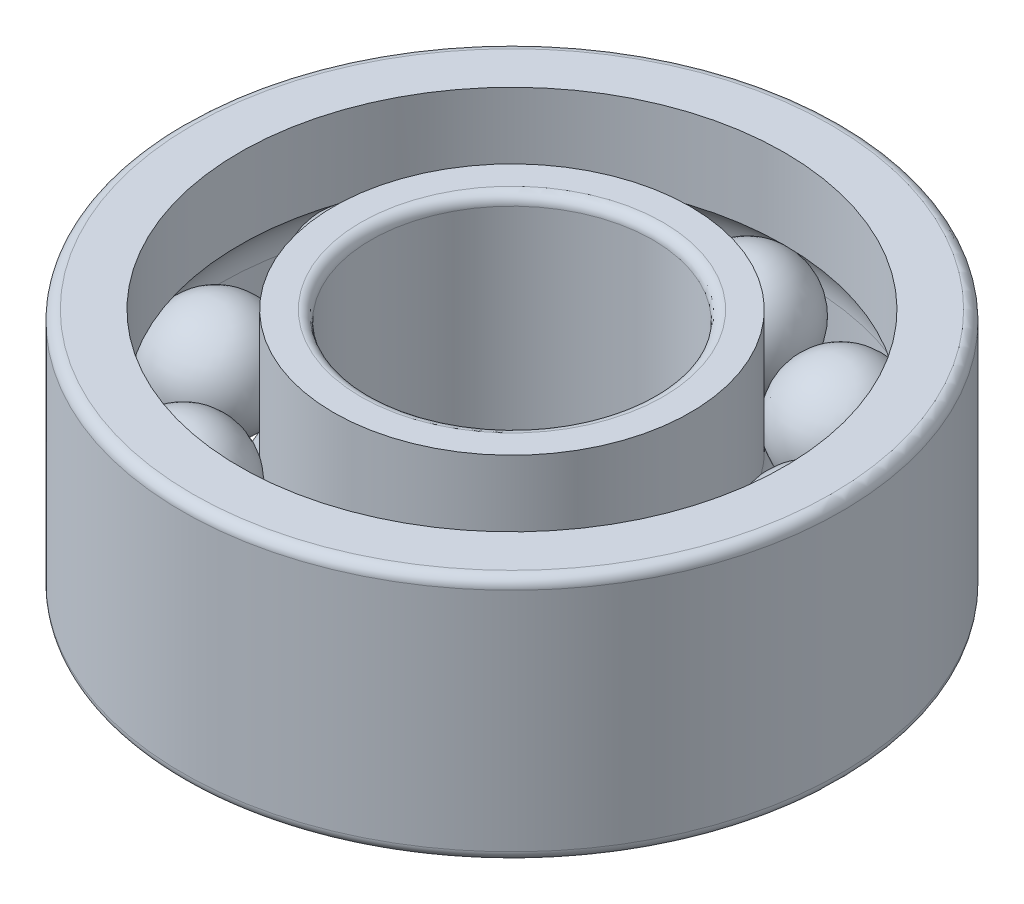
ISO-10303-21;
HEADER;
FILE_DESCRIPTION(('STEP AP214'),'2;1');
FILE_NAME('part.step','',(''),(''),'','','');
FILE_SCHEMA(('AUTOMOTIVE_DESIGN { 1 0 10303 214 1 1 1 1 }'));
ENDSEC;
DATA;
#1=APPLICATION_CONTEXT('core data for automotive mechanical design processes');
#2=APPLICATION_PROTOCOL_DEFINITION('international standard','automotive_design',2000,#1);
#3=PRODUCT_CONTEXT('',#1,'mechanical');
#4=PRODUCT('Part','Part','',(#3));
#5=PRODUCT_RELATED_PRODUCT_CATEGORY('part','',(#4));
#6=PRODUCT_DEFINITION_FORMATION('','',#4);
#7=PRODUCT_DEFINITION_CONTEXT('part definition',#1,'design');
#8=PRODUCT_DEFINITION('design','',#6,#7);
#9=PRODUCT_DEFINITION_SHAPE('','',#8);
#10=(LENGTH_UNIT() NAMED_UNIT(*) SI_UNIT(.MILLI.,.METRE.));
#11=(NAMED_UNIT(*) PLANE_ANGLE_UNIT() SI_UNIT($,.RADIAN.));
#12=(NAMED_UNIT(*) SI_UNIT($,.STERADIAN.) SOLID_ANGLE_UNIT());
#13=UNCERTAINTY_MEASURE_WITH_UNIT(LENGTH_MEASURE(1.E-05),#10,'distance_accuracy_value','');
#14=(GEOMETRIC_REPRESENTATION_CONTEXT(3) GLOBAL_UNCERTAINTY_ASSIGNED_CONTEXT((#13)) GLOBAL_UNIT_ASSIGNED_CONTEXT((#10,
#11,#12)) REPRESENTATION_CONTEXT('',''));
#15=CARTESIAN_POINT('',(0.,0.,0.));
#16=DIRECTION('',(0.,0.,1.));
#17=DIRECTION('',(1.,0.,0.));
#18=AXIS2_PLACEMENT_3D('',#15,#16,#17);
#19=CARTESIAN_POINT('',(15.6938662362087,0.,21.6007537498113));
#20=DIRECTION('',(0.,1.,0.));
#21=DIRECTION('',(-0.587785252292462,0.,-0.809016994374955));
#22=AXIS2_PLACEMENT_3D('',#19,#20,#21);
#23=SPHERICAL_SURFACE('',#22,6.45);
#24=CARTESIAN_POINT('',(15.6938662362087,6.45,21.6007537498113));
#25=VERTEX_POINT('',#24);
#26=VERTEX_LOOP('',#25);
#27=FACE_BOUND('',#26,.T.);
#28=ADVANCED_FACE('F47',(#27),#23,.T.);
#29=CLOSED_SHELL('',(#28));
#30=MANIFOLD_SOLID_BREP('B2',#29);
#31=CARTESIAN_POINT('',(25.3932089850805,0.,8.25075374981138));
#32=DIRECTION('',(0.,1.,0.));
#33=DIRECTION('',(-0.95105651629515,0.,-0.309016994374958));
#34=AXIS2_PLACEMENT_3D('',#31,#32,#33);
#35=SPHERICAL_SURFACE('',#34,6.45);
#36=CARTESIAN_POINT('',(25.3932089850805,6.45,8.25075374981138));
#37=VERTEX_POINT('',#36);
#38=VERTEX_LOOP('',#37);
#39=FACE_BOUND('',#38,.T.);
#40=ADVANCED_FACE('F70',(#39),#35,.T.);
#41=CLOSED_SHELL('',(#40));
#42=MANIFOLD_SOLID_BREP('B6',#41);
#43=CARTESIAN_POINT('',(25.3932089850807,0.,-8.25075374981085));
#44=DIRECTION('',(0.,1.,0.));
#45=DIRECTION('',(-0.951056516295157,0.,0.309016994374938));
#46=AXIS2_PLACEMENT_3D('',#43,#44,#45);
#47=SPHERICAL_SURFACE('',#46,6.45);
#48=CARTESIAN_POINT('',(25.3932089850807,6.45,-8.25075374981085));
#49=VERTEX_POINT('',#48);
#50=VERTEX_LOOP('',#49);
#51=FACE_BOUND('',#50,.T.);
#52=ADVANCED_FACE('F93',(#51),#47,.T.);
#53=CLOSED_SHELL('',(#52));
#54=MANIFOLD_SOLID_BREP('B43',#53);
#55=CARTESIAN_POINT('',(15.6938662362092,0.,-21.600753749811));
#56=DIRECTION('',(0.,1.,0.));
#57=DIRECTION('',(-0.58778525229248,0.,0.809016994374942));
#58=AXIS2_PLACEMENT_3D('',#55,#56,#57);
#59=SPHERICAL_SURFACE('',#58,6.45);
#60=CARTESIAN_POINT('',(15.6938662362092,6.45,-21.600753749811));
#61=VERTEX_POINT('',#60);
#62=VERTEX_LOOP('',#61);
#63=FACE_BOUND('',#62,.T.);
#64=ADVANCED_FACE('F116',(#63),#59,.T.);
#65=CLOSED_SHELL('',(#64));
#66=MANIFOLD_SOLID_BREP('B66',#65);
#67=CARTESIAN_POINT('',(0.,0.,-26.7));
#68=DIRECTION('',(0.,1.,0.));
#69=DIRECTION('',(0.,0.,1.));
#70=AXIS2_PLACEMENT_3D('',#67,#68,#69);
#71=SPHERICAL_SURFACE('',#70,6.45);
#72=CARTESIAN_POINT('',(0.,6.45,-26.7));
#73=VERTEX_POINT('',#72);
#74=VERTEX_LOOP('',#73);
#75=FACE_BOUND('',#74,.T.);
#76=ADVANCED_FACE('F139',(#75),#71,.T.);
#77=CLOSED_SHELL('',(#76));
#78=MANIFOLD_SOLID_BREP('B89',#77);
#79=CARTESIAN_POINT('',(-15.6938662362089,0.,-21.6007537498112));
#80=DIRECTION('',(0.,1.,0.));
#81=DIRECTION('',(0.587785252292469,0.,0.809016994374951));
#82=AXIS2_PLACEMENT_3D('',#79,#80,#81);
#83=SPHERICAL_SURFACE('',#82,6.45);
#84=CARTESIAN_POINT('',(-15.6938662362089,6.45,-21.6007537498112));
#85=VERTEX_POINT('',#84);
#86=VERTEX_LOOP('',#85);
#87=FACE_BOUND('',#86,.T.);
#88=ADVANCED_FACE('F162',(#87),#83,.T.);
#89=CLOSED_SHELL('',(#88));
#90=MANIFOLD_SOLID_BREP('B112',#89);
#91=CARTESIAN_POINT('',(-25.3932089850806,0.,-8.25075374981121));
#92=DIRECTION('',(0.,1.,0.));
#93=DIRECTION('',(0.951056516295152,0.,0.309016994374952));
#94=AXIS2_PLACEMENT_3D('',#91,#92,#93);
#95=SPHERICAL_SURFACE('',#94,6.45);
#96=CARTESIAN_POINT('',(-25.3932089850806,6.45,-8.25075374981121));
#97=VERTEX_POINT('',#96);
#98=VERTEX_LOOP('',#97);
#99=FACE_BOUND('',#98,.T.);
#100=ADVANCED_FACE('F185',(#99),#95,.T.);
#101=CLOSED_SHELL('',(#100));
#102=MANIFOLD_SOLID_BREP('B135',#101);
#103=CARTESIAN_POINT('',(-25.3932089850806,0.,8.25075374981103));
#104=DIRECTION('',(0.,1.,0.));
#105=DIRECTION('',(0.951056516295155,0.,-0.309016994374945));
#106=AXIS2_PLACEMENT_3D('',#103,#104,#105);
#107=SPHERICAL_SURFACE('',#106,6.45);
#108=CARTESIAN_POINT('',(-25.3932089850806,6.45,8.25075374981103));
#109=VERTEX_POINT('',#108);
#110=VERTEX_LOOP('',#109);
#111=FACE_BOUND('',#110,.T.);
#112=ADVANCED_FACE('F208',(#111),#107,.T.);
#113=CLOSED_SHELL('',(#112));
#114=MANIFOLD_SOLID_BREP('B158',#113);
#115=CARTESIAN_POINT('',(-15.6938662362091,0.,21.6007537498111));
#116=DIRECTION('',(0.,1.,0.));
#117=DIRECTION('',(0.587785252292474,0.,-0.809016994374947));
#118=AXIS2_PLACEMENT_3D('',#115,#116,#117);
#119=SPHERICAL_SURFACE('',#118,6.45);
#120=CARTESIAN_POINT('',(-15.6938662362091,6.45,21.6007537498111));
#121=VERTEX_POINT('',#120);
#122=VERTEX_LOOP('',#121);
#123=FACE_BOUND('',#122,.T.);
#124=ADVANCED_FACE('F235',(#123),#119,.T.);
#125=CLOSED_SHELL('',(#124));
#126=MANIFOLD_SOLID_BREP('B181',#125);
#127=CARTESIAN_POINT('',(0.,-0.0229632838449536,0.));
#128=DIRECTION('',(0.,-1.,0.));
#129=DIRECTION('',(0.,0.,-1.));
#130=AXIS2_PLACEMENT_3D('',#127,#128,#129);
#131=TOROIDAL_SURFACE('',#130,26.6500405626193,6.5);
#132=CARTESIAN_POINT('',(0.252383963688109,3.68636503687824,31.9867300999535));
#133=CARTESIAN_POINT('',(0.260656208889091,3.5445636114667,32.0852150036789));
#134=CARTESIAN_POINT('',(0.266886554693484,3.39879101652531,32.1780811531077));
#135=CARTESIAN_POINT('',(0.275805234458957,3.10014926097784,32.3520249057877));
#136=CARTESIAN_POINT('',(0.278491742256618,2.94727648356912,32.4330964120516));
#137=CARTESIAN_POINT('',(0.280534834614072,2.63559016191167,32.5828017152215));
#138=CARTESIAN_POINT('',(0.279892239063473,2.47677808995331,32.6514385702168));
#139=CARTESIAN_POINT('',(0.275157949717124,2.15424175695631,32.7758460149426));
#140=CARTESIAN_POINT('',(0.271066409102136,1.99051771438841,32.8316171759474));
#141=CARTESIAN_POINT('',(0.25898418501443,1.66138643918518,32.929315104418));
#142=CARTESIAN_POINT('',(0.25104320977438,1.49602630523747,32.9714072377528));
#143=CARTESIAN_POINT('',(0.230273330080785,1.16300457504014,33.0423903396603));
#144=CARTESIAN_POINT('',(0.217452212134078,0.995347053068973,33.071302177373));
#145=CARTESIAN_POINT('',(0.191963216120689,0.743358716668108,33.1047112549285));
#146=CARTESIAN_POINT('',(0.182431223807508,0.659327060998694,33.1141852609755));
#147=CARTESIAN_POINT('',(0.160287568285982,0.491368535799036,33.129818925256));
#148=CARTESIAN_POINT('',(0.147679767953049,0.407441666531083,33.1359827099174));
#149=CARTESIAN_POINT('',(0.123618393489666,0.282381163577478,33.1427715622465));
#150=CARTESIAN_POINT('',(0.114723486059502,0.240774633776018,33.1446259137748));
#151=CARTESIAN_POINT('',(0.0940914242858568,0.157991809178973,33.1475182703446));
#152=CARTESIAN_POINT('',(0.0823549160887961,0.116815418792011,33.1485564607439));
#153=CARTESIAN_POINT('',(0.061652260265154,0.0676929592298962,33.1493591138219));
#154=CARTESIAN_POINT('',(0.0571796807248461,0.0579273812820828,33.1494954687493));
#155=CARTESIAN_POINT('',(0.0471208902460045,0.0389960384373981,33.1497187424111));
#156=CARTESIAN_POINT('',(0.0415434927906241,0.0298262441185344,33.1498060326524));
#157=CARTESIAN_POINT('',(0.0328225865920943,0.0190338145677568,33.1498892104213));
#158=CARTESIAN_POINT('',(0.0306972967559119,0.0166105703729159,33.1499063703513));
#159=CARTESIAN_POINT('',(0.0261689412668262,0.0120341765699017,33.1499364856524));
#160=CARTESIAN_POINT('',(0.0237662529932833,0.00988066813684833,33.1499494466465));
#161=CARTESIAN_POINT('',(0.0195160951540838,0.00668929208797244,33.1499673481));
#162=CARTESIAN_POINT('',(0.0177657297608151,0.00552375575737001,33.1499735106599));
#163=CARTESIAN_POINT('',(0.0141114833370889,0.00346241830660003,33.1499839734579));
#164=CARTESIAN_POINT('',(0.0122078725819717,0.0025661549410106,33.149988276893));
#165=CARTESIAN_POINT('',(0.00866242736609553,0.00128263482287279,33.149994273227));
#166=CARTESIAN_POINT('',(0.00704490752207837,0.000829270629142991,33.1499963170222));
#167=CARTESIAN_POINT('',(0.00375680282522259,0.000201845115994235,33.1499991194107));
#168=CARTESIAN_POINT('',(0.00208628345360952,2.74518565230443E-05,33.1499998795314));
#169=CARTESIAN_POINT('',(-0.00126304935712936,-2.14632548680492E-05,33.1500000941997));
#170=CARTESIAN_POINT('',(-0.00294187299070801,0.000104686646123012,33.1499995458225));
#171=CARTESIAN_POINT('',(-0.00625329801205052,0.00064250421298345,33.149997155367));
#172=CARTESIAN_POINT('',(-0.00788584749393301,0.00105448024926351,33.1499953118913));
#173=CARTESIAN_POINT('',(-0.0115649767898482,0.00228745028590424,33.1499896015827));
#174=CARTESIAN_POINT('',(-0.0135818194606106,0.0031959534177786,33.1499852829199));
#175=CARTESIAN_POINT('',(-0.0174470741967891,0.00531796300654049,33.1499745899289));
#176=CARTESIAN_POINT('',(-0.0192950706528845,0.00653219583138063,33.1499682106948));
#177=CARTESIAN_POINT('',(-0.0242335321334583,0.0102163962756607,33.1499475941056));
#178=CARTESIAN_POINT('',(-0.0271478902703073,0.0129188806066908,33.1499311358645));
#179=CARTESIAN_POINT('',(-0.0325819826922368,0.0186913931381788,33.1498918526122));
#180=CARTESIAN_POINT('',(-0.0351003927156599,0.0217625965749852,33.149869006917));
#181=CARTESIAN_POINT('',(-0.0453471923207271,0.0354075494375328,33.1497566691933));
#182=CARTESIAN_POINT('',(-0.0517154049720612,0.0469689284465962,33.1496348694882));
#183=CARTESIAN_POINT('',(-0.0631165512933147,0.0707241007017757,33.1493171037499));
#184=CARTESIAN_POINT('',(-0.0681396474896211,0.0829218130851433,33.1491206154484));
#185=CARTESIAN_POINT('',(-0.0947533479344481,0.153021723860967,33.1477839250028));
#186=CARTESIAN_POINT('',(-0.109104062266744,0.213533560238372,33.14583630493));
#187=CARTESIAN_POINT('',(-0.134156300914475,0.334861842704055,33.1402060255793));
#188=CARTESIAN_POINT('',(-0.14485461294801,0.395678509442506,33.1365218457436));
#189=CARTESIAN_POINT('',(-0.173409555220014,0.578481354877155,33.1228513117146));
#190=CARTESIAN_POINT('',(-0.187748852000472,0.700916568354456,33.1102452734775));
#191=CARTESIAN_POINT('',(-0.212311752894574,0.945298027938485,33.0780278373179));
#192=CARTESIAN_POINT('',(-0.222529804820838,1.06724339673877,33.058407055698));
#193=CARTESIAN_POINT('',(-0.23992806679979,1.31013386843787,33.0121971145105));
#194=CARTESIAN_POINT('',(-0.247106402077047,1.43107830905556,32.9856036708063));
#195=CARTESIAN_POINT('',(-0.259152949926417,1.67129687097025,32.9255501411022));
#196=CARTESIAN_POINT('',(-0.264022090299802,1.79057164438985,32.8920928206629));
#197=CARTESIAN_POINT('',(-0.273040882671827,2.06554459390574,32.8064253067602));
#198=CARTESIAN_POINT('',(-0.276442019418958,2.22047797115994,32.7516546511512));
#199=CARTESIAN_POINT('',(-0.280157505782285,2.52584362405565,32.6305249624497));
#200=CARTESIAN_POINT('',(-0.28047062056382,2.67627407510246,32.5641613043551));
#201=CARTESIAN_POINT('',(-0.278080425489897,2.97146849481483,32.4203552866205));
#202=CARTESIAN_POINT('',(-0.275381196119432,3.11623985456509,32.3429280373358));
#203=CARTESIAN_POINT('',(-0.266807058259131,3.39945065173162,32.1774051030137));
#204=CARTESIAN_POINT('',(-0.260932245958859,3.53789028080058,32.0893097411799));
#205=CARTESIAN_POINT('',(-0.245505079958013,3.80604939330185,31.904087949885));
#206=CARTESIAN_POINT('',(-0.235995180627584,3.93584995397949,31.807075248602));
#207=CARTESIAN_POINT('',(-0.212161190090144,4.18762165803646,31.6038370393231));
#208=CARTESIAN_POINT('',(-0.197837186602847,4.3095929440279,31.4976116992206));
#209=CARTESIAN_POINT('',(-0.169569059648835,4.48576731024326,31.3323001827256));
#210=CARTESIAN_POINT('',(-0.159021184428882,4.54334149847407,31.2762227465834));
#211=CARTESIAN_POINT('',(-0.134110682708847,4.65585805248138,31.1625161761625));
#212=CARTESIAN_POINT('',(-0.119755391181676,4.71080524145747,31.1048902149304));
#213=CARTESIAN_POINT('',(-0.0908246880062974,4.79068942862702,31.0180059667305));
#214=CARTESIAN_POINT('',(-0.0799469674604429,4.81689676387752,30.9889679406641));
#215=CARTESIAN_POINT('',(-0.0612080660203232,4.84807878479397,30.953820570701));
#216=CARTESIAN_POINT('',(-0.0571868464343354,4.85425854073552,30.9468232616956));
#217=CARTESIAN_POINT('',(-0.0482216082349304,4.86631087534585,30.9331189130323));
#218=CARTESIAN_POINT('',(-0.0432788487805913,4.87218385932393,30.9264114925045));
#219=CARTESIAN_POINT('',(-0.0350628913511346,4.87989573070531,30.9175710761967));
#220=CARTESIAN_POINT('',(-0.0325194347406647,4.88207437394064,30.9150693807473));
#221=CARTESIAN_POINT('',(-0.0270050048085733,4.88617824258789,30.9103503514683));
#222=CARTESIAN_POINT('',(-0.02403645660779,4.88810479430157,30.9081315311084));
#223=CARTESIAN_POINT('',(-0.0193219668390379,4.8905406335083,30.9053231046116));
#224=CARTESIAN_POINT('',(-0.0178106885266538,4.89124348589338,30.9045122635441));
#225=CARTESIAN_POINT('',(-0.0146588727792968,4.89251533479544,30.9030444009224));
#226=CARTESIAN_POINT('',(-0.013018307812388,4.89308430269798,30.9023874122505));
#227=CARTESIAN_POINT('',(-0.00958987164248328,4.89404701063116,30.9012754514367));
#228=CARTESIAN_POINT('',(-0.00780023959557749,4.8944381478915,30.9008234801832));
#229=CARTESIAN_POINT('',(-0.00413879453922427,4.894979504996,30.9001978551859));
#230=CARTESIAN_POINT('',(-0.002267202669889,4.89513033648331,30.900023494848));
#231=CARTESIAN_POINT('',(0.00123409373495767,4.8951647300227,30.8999837374852));
#232=CARTESIAN_POINT('',(0.00286318204558427,4.8950808845728,30.900080663538));
#233=CARTESIAN_POINT('',(0.00607326121639443,4.89472538585255,30.9004915388581));
#234=CARTESIAN_POINT('',(0.00765418801043371,4.89445349292747,30.9008057650608));
#235=CARTESIAN_POINT('',(0.0111630971778617,4.89365333938082,30.9017302067112));
#236=CARTESIAN_POINT('',(0.013063682430368,4.8930744915223,30.902398802949));
#237=CARTESIAN_POINT('',(0.0167023785957794,4.89172948960406,30.9039514772051));
#238=CARTESIAN_POINT('',(0.0184401141056238,4.89096291680461,30.9048360369387));
#239=CARTESIAN_POINT('',(0.0231222425021256,4.88862249557168,30.9075348904644));
#240=CARTESIAN_POINT('',(0.0258925559035371,4.886900781645,30.9095183433353));
#241=CARTESIAN_POINT('',(0.0310535586534742,4.88322730927635,30.9137443397438));
#242=CARTESIAN_POINT('',(0.0334429383635908,4.88127479577217,30.9159877331773));
#243=CARTESIAN_POINT('',(0.0433076232012195,4.87247369124838,30.926084319145));
#244=CARTESIAN_POINT('',(0.0494332292389784,4.86497620194535,30.9346459584401));
#245=CARTESIAN_POINT('',(0.0603962209104175,4.84953933894414,30.9521747260803));
#246=CARTESIAN_POINT('',(0.0652241738246599,4.84159721129014,30.9611442971704));
#247=CARTESIAN_POINT('',(0.0909960807059878,4.79549639229806,31.0129052247376));
#248=CARTESIAN_POINT('',(0.104890317039222,4.75511565635161,31.0570731035044));
#249=CARTESIAN_POINT('',(0.129238086238699,4.67290938138696,31.1444908377327));
#250=CARTESIAN_POINT('',(0.139689977391992,4.63108316347016,31.187740245988));
#251=CARTESIAN_POINT('',(0.164017114540787,4.51985848652424,31.2995804902618));
#252=CARTESIAN_POINT('',(0.176066483807718,4.44926740683659,31.3674629817502));
#253=CARTESIAN_POINT('',(0.197283935372346,4.30484952877823,31.5001685176239));
#254=CARTESIAN_POINT('',(0.206449225972206,4.23101967363755,31.5649885463901));
#255=CARTESIAN_POINT('',(0.230831419198164,4.00500561132428,31.7545047006049));
#256=CARTESIAN_POINT('',(0.242938711651523,3.84827394668668,31.8742800075198));
#257=CARTESIAN_POINT('',(0.252383963688109,3.68636503687824,31.9867300999535));
#258=B_SPLINE_CURVE_WITH_KNOTS('',3,(#132,#133,#134,#135,#136,#137,#138,#139,#140,#141,#142,
#143,#144,#145,#146,#147,#148,#149,#150,#151,#152,#153,#154,#155,#156,#157,#158,#159,#160,#161,
#162,#163,#164,#165,#166,#167,#168,#169,#170,#171,#172,#173,#174,#175,#176,#177,#178,#179,#180,
#181,#182,#183,#184,#185,#186,#187,#188,#189,#190,#191,#192,#193,#194,#195,#196,#197,#198,#199,
#200,#201,#202,#203,#204,#205,#206,#207,#208,#209,#210,#211,#212,#213,#214,#215,#216,#217,#218,
#219,#220,#221,#222,#223,#224,#225,#226,#227,#228,#229,#230,#231,#232,#233,#234,#235,#236,#237,
#238,#239,#240,#241,#242,#243,#244,#245,#246,#247,#248,#249,#250,#251,#252,#253,#254,#255,#256,
#257),.UNSPECIFIED.,.T.,.F.,(4,2,2,2,2,2,2,2,2,2,2,2,2,2,2,2,2,2,2,2,2,2,2,2,2,2,2,2,2,2,2,2,2,
2,2,2,2,2,2,2,2,2,2,2,2,2,2,2,2,2,2,2,2,2,2,2,2,2,2,2,2,2,4),(0.,0.518318683059782,
1.03690435499933,1.55536231603769,2.0737972516001,2.58570904464271,3.0968074580889,
3.35206528428143,3.60700417035991,3.73483410001781,3.86263498991483,3.89484794879322,
3.92681359414192,3.93646875476802,3.94611093171709,3.95240329101218,3.95868478603235,
3.9637034027509,3.96871604349795,3.97373989865408,3.97876918236298,3.98536756690847,
3.99198177864315,4.00383821394675,4.01573349656413,4.05502658234325,4.09459964030197,
4.2801567675352,4.46587667405707,4.83702055817462,5.20866279463662,5.58053391246479,
5.95225549098251,6.44482280619996,6.93758708068471,7.42968467196212,7.9217673582594,
8.40827039820686,8.89476457386873,9.13783074899872,9.3804320171573,9.50175249048244,
9.53223191677817,9.56266999829418,9.5751920310924,9.58764527960281,9.59319405411672,
9.59874401346659,9.60437277666685,9.60998719012264,9.61486195661434,9.61974294716591,
9.62599629061712,9.63226371191864,9.64365161344629,9.65507785912609,9.69355210796621,
9.73229889619832,9.91555480007759,10.0988979756822,10.3945699041145,10.6905271595447,
11.2823435863825),.UNSPECIFIED.);
#259=CARTESIAN_POINT('',(0.,1.02185732500501E-12,33.15));
#260=VERTEX_POINT('',#259);
#261=CARTESIAN_POINT('',(0.,4.89515066162421,30.9));
#262=VERTEX_POINT('',#261);
#263=EDGE_CURVE('E233',#260,#262,#258,.T.);
#264=ORIENTED_EDGE('',*,*,#263,.F.);
#265=CARTESIAN_POINT('',(0.,0.,0.));
#266=DIRECTION('',(0.,-1.,0.));
#267=DIRECTION('',(0.,0.,-1.));
#268=AXIS2_PLACEMENT_3D('',#265,#266,#267);
#269=CIRCLE('',#268,33.15);
#270=EDGE_CURVE('E274',#260,#260,#269,.T.);
#271=ORIENTED_EDGE('',*,*,#270,.T.);
#272=EDGE_CURVE('E262',#262,#260,#258,.T.);
#273=ORIENTED_EDGE('',*,*,#272,.F.);
#274=CARTESIAN_POINT('',(0.,4.89515066162421,0.));
#275=DIRECTION('',(0.,-1.,0.));
#276=DIRECTION('',(0.,0.,-1.));
#277=AXIS2_PLACEMENT_3D('',#274,#275,#276);
#278=CIRCLE('',#277,30.9);
#279=EDGE_CURVE('E281',#262,#262,#278,.T.);
#280=ORIENTED_EDGE('',*,*,#279,.F.);
#281=EDGE_LOOP('',(#264,#271,#273,#280));
#282=FACE_BOUND('',#281,.T.);
#283=ADVANCED_FACE('F257',(#282),#131,.F.);
#284=CARTESIAN_POINT('',(0.,0.,0.));
#285=DIRECTION('',(0.,-1.,0.));
#286=DIRECTION('',(0.,0.,-1.));
#287=AXIS2_PLACEMENT_3D('',#284,#285,#286);
#288=CYLINDRICAL_SURFACE('',#287,33.15);
#289=ORIENTED_EDGE('',*,*,#270,.F.);
#290=EDGE_LOOP('',(#289));
#291=FACE_BOUND('',#290,.T.);
#292=CARTESIAN_POINT('',(0.,-14.,0.));
#293=DIRECTION('',(0.,-1.,0.));
#294=DIRECTION('',(0.,0.,-1.));
#295=AXIS2_PLACEMENT_3D('',#292,#293,#294);
#296=CIRCLE('',#295,33.15);
#297=CARTESIAN_POINT('',(0.,-14.,-33.15));
#298=VERTEX_POINT('',#297);
#299=EDGE_CURVE('E302',#298,#298,#296,.T.);
#300=ORIENTED_EDGE('',*,*,#299,.T.);
#301=EDGE_LOOP('',(#300));
#302=FACE_BOUND('',#301,.T.);
#303=ADVANCED_FACE('F306',(#291,#302),#288,.F.);
#304=CARTESIAN_POINT('',(0.,-14.,33.15));
#305=DIRECTION('',(0.,1.,0.));
#306=DIRECTION('',(0.,0.,1.));
#307=AXIS2_PLACEMENT_3D('',#304,#305,#306);
#308=PLANE('',#307);
#309=ORIENTED_EDGE('',*,*,#299,.F.);
#310=EDGE_LOOP('',(#309));
#311=FACE_BOUND('',#310,.T.);
#312=CARTESIAN_POINT('',(0.,-14.,0.));
#313=DIRECTION('',(0.,-1.,0.));
#314=DIRECTION('',(0.,0.,-1.));
#315=AXIS2_PLACEMENT_3D('',#312,#313,#314);
#316=CIRCLE('',#315,36.25);
#317=CARTESIAN_POINT('',(0.,-14.,-36.25));
#318=VERTEX_POINT('',#317);
#319=EDGE_CURVE('E299',#318,#318,#316,.T.);
#320=ORIENTED_EDGE('',*,*,#319,.T.);
#321=EDGE_LOOP('',(#320));
#322=FACE_BOUND('',#321,.T.);
#323=ADVANCED_FACE('F308',(#311,#322),#308,.F.);
#324=CARTESIAN_POINT('',(0.,-12.85,0.));
#325=DIRECTION('',(0.,-1.,0.));
#326=DIRECTION('',(0.,0.,-1.));
#327=AXIS2_PLACEMENT_3D('',#324,#325,#326);
#328=TOROIDAL_SURFACE('',#327,36.25,1.15);
#329=ORIENTED_EDGE('',*,*,#319,.F.);
#330=EDGE_LOOP('',(#329));
#331=FACE_BOUND('',#330,.T.);
#332=CARTESIAN_POINT('',(0.,-12.85,0.));
#333=DIRECTION('',(0.,-1.,0.));
#334=DIRECTION('',(0.,0.,-1.));
#335=AXIS2_PLACEMENT_3D('',#332,#333,#334);
#336=CIRCLE('',#335,37.4);
#337=CARTESIAN_POINT('',(0.,-12.85,-37.4));
#338=VERTEX_POINT('',#337);
#339=EDGE_CURVE('E296',#338,#338,#336,.T.);
#340=ORIENTED_EDGE('',*,*,#339,.T.);
#341=EDGE_LOOP('',(#340));
#342=FACE_BOUND('',#341,.T.);
#343=ADVANCED_FACE('F311',(#331,#342),#328,.T.);
#344=CARTESIAN_POINT('',(0.,0.,0.));
#345=DIRECTION('',(0.,-1.,0.));
#346=DIRECTION('',(0.,0.,-1.));
#347=AXIS2_PLACEMENT_3D('',#344,#345,#346);
#348=CYLINDRICAL_SURFACE('',#347,37.4);
#349=ORIENTED_EDGE('',*,*,#339,.F.);
#350=EDGE_LOOP('',(#349));
#351=FACE_BOUND('',#350,.T.);
#352=CARTESIAN_POINT('',(0.,12.85,0.));
#353=DIRECTION('',(0.,-1.,0.));
#354=DIRECTION('',(0.,0.,-1.));
#355=AXIS2_PLACEMENT_3D('',#352,#353,#354);
#356=CIRCLE('',#355,37.4);
#357=CARTESIAN_POINT('',(0.,12.85,-37.4));
#358=VERTEX_POINT('',#357);
#359=EDGE_CURVE('E293',#358,#358,#356,.T.);
#360=ORIENTED_EDGE('',*,*,#359,.T.);
#361=EDGE_LOOP('',(#360));
#362=FACE_BOUND('',#361,.T.);
#363=ADVANCED_FACE('F317',(#351,#362),#348,.T.);
#364=CARTESIAN_POINT('',(0.,12.85,0.));
#365=DIRECTION('',(0.,-1.,0.));
#366=DIRECTION('',(0.,0.,-1.));
#367=AXIS2_PLACEMENT_3D('',#364,#365,#366);
#368=TOROIDAL_SURFACE('',#367,36.25,1.15);
#369=ORIENTED_EDGE('',*,*,#359,.F.);
#370=EDGE_LOOP('',(#369));
#371=FACE_BOUND('',#370,.T.);
#372=CARTESIAN_POINT('',(0.,14.,0.));
#373=DIRECTION('',(0.,-1.,0.));
#374=DIRECTION('',(0.,0.,-1.));
#375=AXIS2_PLACEMENT_3D('',#372,#373,#374);
#376=CIRCLE('',#375,36.25);
#377=CARTESIAN_POINT('',(0.,14.,-36.25));
#378=VERTEX_POINT('',#377);
#379=EDGE_CURVE('E288',#378,#378,#376,.T.);
#380=ORIENTED_EDGE('',*,*,#379,.T.);
#381=EDGE_LOOP('',(#380));
#382=FACE_BOUND('',#381,.T.);
#383=ADVANCED_FACE('F323',(#371,#382),#368,.T.);
#384=CARTESIAN_POINT('',(0.,14.,36.25));
#385=DIRECTION('',(0.,-1.,0.));
#386=DIRECTION('',(0.,0.,-1.));
#387=AXIS2_PLACEMENT_3D('',#384,#385,#386);
#388=PLANE('',#387);
#389=ORIENTED_EDGE('',*,*,#379,.F.);
#390=EDGE_LOOP('',(#389));
#391=FACE_BOUND('',#390,.T.);
#392=CARTESIAN_POINT('',(0.,14.,0.));
#393=DIRECTION('',(0.,-1.,0.));
#394=DIRECTION('',(0.,0.,-1.));
#395=AXIS2_PLACEMENT_3D('',#392,#393,#394);
#396=CIRCLE('',#395,30.9);
#397=CARTESIAN_POINT('',(0.,14.,-30.9));
#398=VERTEX_POINT('',#397);
#399=EDGE_CURVE('E285',#398,#398,#396,.T.);
#400=ORIENTED_EDGE('',*,*,#399,.T.);
#401=EDGE_LOOP('',(#400));
#402=FACE_BOUND('',#401,.T.);
#403=ADVANCED_FACE('F329',(#391,#402),#388,.F.);
#404=CARTESIAN_POINT('',(0.,0.,0.));
#405=DIRECTION('',(0.,-1.,0.));
#406=DIRECTION('',(0.,0.,-1.));
#407=AXIS2_PLACEMENT_3D('',#404,#405,#406);
#408=CYLINDRICAL_SURFACE('',#407,30.9);
#409=ORIENTED_EDGE('',*,*,#399,.F.);
#410=EDGE_LOOP('',(#409));
#411=FACE_BOUND('',#410,.T.);
#412=ORIENTED_EDGE('',*,*,#279,.T.);
#413=EDGE_LOOP('',(#412));
#414=FACE_BOUND('',#413,.T.);
#415=ADVANCED_FACE('F284',(#411,#414),#408,.F.);
#416=CARTESIAN_POINT('',(0.,0.,26.7));
#417=DIRECTION('',(0.,1.,0.));
#418=DIRECTION('',(0.,0.,-1.));
#419=AXIS2_PLACEMENT_3D('',#416,#417,#418);
#420=SPHERICAL_SURFACE('',#419,6.45);
#421=ORIENTED_EDGE('',*,*,#272,.T.);
#422=ORIENTED_EDGE('',*,*,#263,.T.);
#423=EDGE_LOOP('',(#421,#422));
#424=FACE_BOUND('',#423,.T.);
#425=ADVANCED_FACE('F259',(#424),#420,.T.);
#426=CLOSED_SHELL('',(#283,#303,#323,#343,#363,#383,#403,#415,#425));
#427=MANIFOLD_SOLID_BREP('B204',#426);
#428=CARTESIAN_POINT('',(0.,0.,0.));
#429=DIRECTION('',(0.,-1.,0.));
#430=DIRECTION('',(0.,0.,-1.));
#431=AXIS2_PLACEMENT_3D('',#428,#429,#430);
#432=CYLINDRICAL_SURFACE('',#431,20.25);
#433=CARTESIAN_POINT('',(0.,0.,0.));
#434=DIRECTION('',(0.,-1.,0.));
#435=DIRECTION('',(0.,0.,-1.));
#436=AXIS2_PLACEMENT_3D('',#433,#434,#435);
#437=CIRCLE('',#436,20.25);
#438=CARTESIAN_POINT('',(0.,0.,-20.25));
#439=VERTEX_POINT('',#438);
#440=EDGE_CURVE('E447',#439,#439,#437,.T.);
#441=ORIENTED_EDGE('',*,*,#440,.F.);
#442=EDGE_LOOP('',(#441));
#443=FACE_BOUND('',#442,.T.);
#444=CARTESIAN_POINT('',(0.,14.,0.));
#445=DIRECTION('',(0.,-1.,0.));
#446=DIRECTION('',(0.,0.,-1.));
#447=AXIS2_PLACEMENT_3D('',#444,#445,#446);
#448=CIRCLE('',#447,20.25);
#449=CARTESIAN_POINT('',(0.,14.,-20.25));
#450=VERTEX_POINT('',#449);
#451=EDGE_CURVE('E256',#450,#450,#448,.T.);
#452=ORIENTED_EDGE('',*,*,#451,.T.);
#453=EDGE_LOOP('',(#452));
#454=FACE_BOUND('',#453,.T.);
#455=ADVANCED_FACE('F419',(#443,#454),#432,.T.);
#456=CARTESIAN_POINT('',(0.,14.,17.15));
#457=DIRECTION('',(0.,-1.,0.));
#458=DIRECTION('',(0.,0.,-1.));
#459=AXIS2_PLACEMENT_3D('',#456,#457,#458);
#460=PLANE('',#459);
#461=ORIENTED_EDGE('',*,*,#451,.F.);
#462=EDGE_LOOP('',(#461));
#463=FACE_BOUND('',#462,.T.);
#464=CARTESIAN_POINT('',(0.,14.,0.));
#465=DIRECTION('',(0.,-1.,0.));
#466=DIRECTION('',(0.,0.,-1.));
#467=AXIS2_PLACEMENT_3D('',#464,#465,#466);
#468=CIRCLE('',#467,17.15);
#469=CARTESIAN_POINT('',(0.,14.,-17.15));
#470=VERTEX_POINT('',#469);
#471=EDGE_CURVE('E425',#470,#470,#468,.T.);
#472=ORIENTED_EDGE('',*,*,#471,.T.);
#473=EDGE_LOOP('',(#472));
#474=FACE_BOUND('',#473,.T.);
#475=ADVANCED_FACE('F454',(#463,#474),#460,.F.);
#476=CARTESIAN_POINT('',(0.,12.85,0.));
#477=DIRECTION('',(0.,-1.,0.));
#478=DIRECTION('',(0.,0.,-1.));
#479=AXIS2_PLACEMENT_3D('',#476,#477,#478);
#480=TOROIDAL_SURFACE('',#479,17.15,1.15);
#481=ORIENTED_EDGE('',*,*,#471,.F.);
#482=EDGE_LOOP('',(#481));
#483=FACE_BOUND('',#482,.T.);
#484=CARTESIAN_POINT('',(0.,12.85,0.));
#485=DIRECTION('',(0.,-1.,0.));
#486=DIRECTION('',(0.,0.,-1.));
#487=AXIS2_PLACEMENT_3D('',#484,#485,#486);
#488=CIRCLE('',#487,16.);
#489=CARTESIAN_POINT('',(0.,12.85,-16.));
#490=VERTEX_POINT('',#489);
#491=EDGE_CURVE('E429',#490,#490,#488,.T.);
#492=ORIENTED_EDGE('',*,*,#491,.T.);
#493=EDGE_LOOP('',(#492));
#494=FACE_BOUND('',#493,.T.);
#495=ADVANCED_FACE('F458',(#483,#494),#480,.T.);
#496=CARTESIAN_POINT('',(0.,0.,0.));
#497=DIRECTION('',(0.,-1.,0.));
#498=DIRECTION('',(0.,0.,-1.));
#499=AXIS2_PLACEMENT_3D('',#496,#497,#498);
#500=CYLINDRICAL_SURFACE('',#499,16.);
#501=CARTESIAN_POINT('',(0.,-12.85,0.));
#502=DIRECTION('',(0.,-1.,0.));
#503=DIRECTION('',(0.,0.,-1.));
#504=AXIS2_PLACEMENT_3D('',#501,#502,#503);
#505=CIRCLE('',#504,16.);
#506=CARTESIAN_POINT('',(0.,-12.85,-16.));
#507=VERTEX_POINT('',#506);
#508=EDGE_CURVE('E433',#507,#507,#505,.T.);
#509=ORIENTED_EDGE('',*,*,#508,.T.);
#510=EDGE_LOOP('',(#509));
#511=FACE_BOUND('',#510,.T.);
#512=ORIENTED_EDGE('',*,*,#491,.F.);
#513=EDGE_LOOP('',(#512));
#514=FACE_BOUND('',#513,.T.);
#515=ADVANCED_FACE('F463',(#511,#514),#500,.F.);
#516=CARTESIAN_POINT('',(0.,-12.85,0.));
#517=DIRECTION('',(0.,-1.,0.));
#518=DIRECTION('',(0.,0.,-1.));
#519=AXIS2_PLACEMENT_3D('',#516,#517,#518);
#520=TOROIDAL_SURFACE('',#519,17.15,1.15);
#521=CARTESIAN_POINT('',(0.,-14.,0.));
#522=DIRECTION('',(0.,-1.,0.));
#523=DIRECTION('',(0.,0.,-1.));
#524=AXIS2_PLACEMENT_3D('',#521,#522,#523);
#525=CIRCLE('',#524,17.15);
#526=CARTESIAN_POINT('',(0.,-14.,-17.15));
#527=VERTEX_POINT('',#526);
#528=EDGE_CURVE('E438',#527,#527,#525,.T.);
#529=ORIENTED_EDGE('',*,*,#528,.T.);
#530=EDGE_LOOP('',(#529));
#531=FACE_BOUND('',#530,.T.);
#532=ORIENTED_EDGE('',*,*,#508,.F.);
#533=EDGE_LOOP('',(#532));
#534=FACE_BOUND('',#533,.T.);
#535=ADVANCED_FACE('F469',(#531,#534),#520,.T.);
#536=CARTESIAN_POINT('',(0.,-14.,17.15));
#537=DIRECTION('',(0.,-1.,0.));
#538=DIRECTION('',(0.,0.,-1.));
#539=AXIS2_PLACEMENT_3D('',#536,#537,#538);
#540=PLANE('',#539);
#541=CARTESIAN_POINT('',(0.,-14.,0.));
#542=DIRECTION('',(0.,-1.,0.));
#543=DIRECTION('',(0.,0.,-1.));
#544=AXIS2_PLACEMENT_3D('',#541,#542,#543);
#545=CIRCLE('',#544,22.5);
#546=CARTESIAN_POINT('',(0.,-14.,-22.5));
#547=VERTEX_POINT('',#546);
#548=EDGE_CURVE('E441',#547,#547,#545,.T.);
#549=ORIENTED_EDGE('',*,*,#548,.T.);
#550=EDGE_LOOP('',(#549));
#551=FACE_BOUND('',#550,.T.);
#552=ORIENTED_EDGE('',*,*,#528,.F.);
#553=EDGE_LOOP('',(#552));
#554=FACE_BOUND('',#553,.T.);
#555=ADVANCED_FACE('F473',(#551,#554),#540,.T.);
#556=CARTESIAN_POINT('',(0.,0.,0.));
#557=DIRECTION('',(0.,-1.,0.));
#558=DIRECTION('',(0.,0.,-1.));
#559=AXIS2_PLACEMENT_3D('',#556,#557,#558);
#560=CYLINDRICAL_SURFACE('',#559,22.5);
#561=CARTESIAN_POINT('',(0.,-4.91807889322649,0.));
#562=DIRECTION('',(0.,-1.,0.));
#563=DIRECTION('',(0.,0.,-1.));
#564=AXIS2_PLACEMENT_3D('',#561,#562,#563);
#565=CIRCLE('',#564,22.5);
#566=CARTESIAN_POINT('',(0.,-4.91807889322649,-22.5));
#567=VERTEX_POINT('',#566);
#568=EDGE_CURVE('E444',#567,#567,#565,.T.);
#569=ORIENTED_EDGE('',*,*,#568,.T.);
#570=EDGE_LOOP('',(#569));
#571=FACE_BOUND('',#570,.T.);
#572=ORIENTED_EDGE('',*,*,#548,.F.);
#573=EDGE_LOOP('',(#572));
#574=FACE_BOUND('',#573,.T.);
#575=ADVANCED_FACE('F477',(#571,#574),#560,.T.);
#576=CARTESIAN_POINT('',(0.,0.,0.));
#577=DIRECTION('',(0.,-1.,0.));
#578=DIRECTION('',(0.,0.,-1.));
#579=AXIS2_PLACEMENT_3D('',#576,#577,#578);
#580=TOROIDAL_SURFACE('',#579,26.75,6.5);
#581=ORIENTED_EDGE('',*,*,#568,.F.);
#582=EDGE_LOOP('',(#581));
#583=FACE_BOUND('',#582,.T.);
#584=ORIENTED_EDGE('',*,*,#440,.T.);
#585=EDGE_LOOP('',(#584));
#586=FACE_BOUND('',#585,.T.);
#587=ADVANCED_FACE('F451',(#583,#586),#580,.F.);
#588=CLOSED_SHELL('',(#455,#475,#495,#515,#535,#555,#575,#587));
#589=MANIFOLD_SOLID_BREP('B227',#588);
#590=ADVANCED_BREP_SHAPE_REPRESENTATION('',(#18,#30,#42,#54,#66,#78,#90,#102,#114,#126,#427,
#589),#14);
#591=SHAPE_DEFINITION_REPRESENTATION(#9,#590);
ENDSEC;
END-ISO-10303-21;
